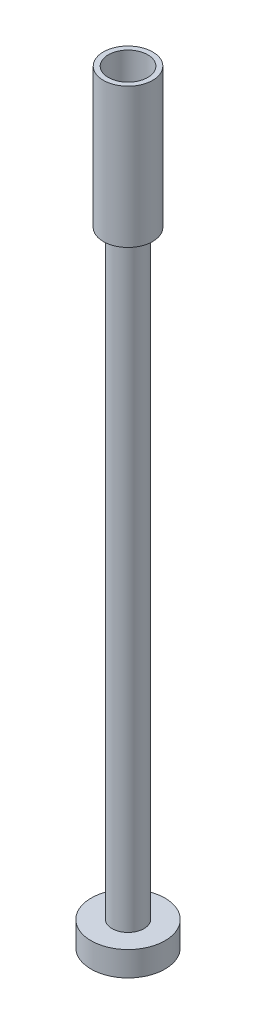
ISO-10303-21;
HEADER;
FILE_DESCRIPTION(('STEP AP214'),'2;1');
FILE_NAME('part.step','',(''),(''),'','','');
FILE_SCHEMA(('AUTOMOTIVE_DESIGN { 1 0 10303 214 1 1 1 1 }'));
ENDSEC;
DATA;
#1=APPLICATION_CONTEXT('core data for automotive mechanical design processes');
#2=APPLICATION_PROTOCOL_DEFINITION('international standard','automotive_design',2000,#1);
#3=PRODUCT_CONTEXT('',#1,'mechanical');
#4=PRODUCT('Part','Part','',(#3));
#5=PRODUCT_RELATED_PRODUCT_CATEGORY('part','',(#4));
#6=PRODUCT_DEFINITION_FORMATION('','',#4);
#7=PRODUCT_DEFINITION_CONTEXT('part definition',#1,'design');
#8=PRODUCT_DEFINITION('design','',#6,#7);
#9=PRODUCT_DEFINITION_SHAPE('','',#8);
#10=(LENGTH_UNIT() NAMED_UNIT(*) SI_UNIT(.MILLI.,.METRE.));
#11=(NAMED_UNIT(*) PLANE_ANGLE_UNIT() SI_UNIT($,.RADIAN.));
#12=(NAMED_UNIT(*) SI_UNIT($,.STERADIAN.) SOLID_ANGLE_UNIT());
#13=UNCERTAINTY_MEASURE_WITH_UNIT(LENGTH_MEASURE(1.E-05),#10,'distance_accuracy_value','');
#14=(GEOMETRIC_REPRESENTATION_CONTEXT(3) GLOBAL_UNCERTAINTY_ASSIGNED_CONTEXT((#13)) GLOBAL_UNIT_ASSIGNED_CONTEXT((#10,
#11,#12)) REPRESENTATION_CONTEXT('',''));
#15=CARTESIAN_POINT('',(0.,0.,0.));
#16=DIRECTION('',(0.,0.,1.));
#17=DIRECTION('',(1.,0.,0.));
#18=AXIS2_PLACEMENT_3D('',#15,#16,#17);
#19=CARTESIAN_POINT('',(-5.56320867014476,38.1,0.43512799364264));
#20=DIRECTION('',(0.,-1.,0.));
#21=DIRECTION('',(0.,0.,-1.));
#22=AXIS2_PLACEMENT_3D('',#19,#20,#21);
#23=CYLINDRICAL_SURFACE('',#22,0.8255);
#24=CARTESIAN_POINT('',(-5.56320867014476,0.,0.43512799364264));
#25=DIRECTION('',(0.,1.,0.));
#26=DIRECTION('',(0.,0.,1.));
#27=AXIS2_PLACEMENT_3D('',#24,#25,#26);
#28=CIRCLE('',#27,0.8255);
#29=CARTESIAN_POINT('',(-5.56320867014476,0.,-0.39037200635736));
#30=VERTEX_POINT('',#29);
#31=EDGE_CURVE('E269',#30,#30,#28,.T.);
#32=CARTESIAN_POINT('',(-5.56320867014476,30.8993926405873,0.43512799364264));
#33=DIRECTION('',(0.,1.,0.));
#34=DIRECTION('',(0.,0.,1.));
#35=AXIS2_PLACEMENT_3D('',#32,#33,#34);
#36=CIRCLE('',#35,0.8255);
#37=CARTESIAN_POINT('',(-5.56320867014476,30.8993926405873,-0.39037200635736));
#38=VERTEX_POINT('',#37);
#39=EDGE_CURVE('E274',#38,#38,#36,.T.);
#40=CARTESIAN_POINT('',(-5.56320867014476,0.,-0.39037200635736));
#41=CARTESIAN_POINT('',(-5.56320867014476,0.321868673339449,-0.39037200635736));
#42=CARTESIAN_POINT('',(-5.56320867014476,0.643737346678899,-0.39037200635736));
#43=CARTESIAN_POINT('',(-5.56320867014476,1.2874746933578,-0.39037200635736));
#44=CARTESIAN_POINT('',(-5.56320867014476,1.60934336669725,-0.39037200635736));
#45=CARTESIAN_POINT('',(-5.56320867014476,2.25308071337615,-0.39037200635736));
#46=CARTESIAN_POINT('',(-5.56320867014476,2.5749493867156,-0.39037200635736));
#47=CARTESIAN_POINT('',(-5.56320867014476,3.21868673339451,-0.39037200635736));
#48=CARTESIAN_POINT('',(-5.56320867014476,3.54055540673396,-0.39037200635736));
#49=CARTESIAN_POINT('',(-5.56320867014476,4.18429275341286,-0.39037200635736));
#50=CARTESIAN_POINT('',(-5.56320867014476,4.50616142675231,-0.39037200635736));
#51=CARTESIAN_POINT('',(-5.56320867014476,5.14989877343121,-0.39037200635736));
#52=CARTESIAN_POINT('',(-5.56320867014476,5.47176744677066,-0.39037200635736));
#53=CARTESIAN_POINT('',(-5.56320867014476,6.11550479344956,-0.39037200635736));
#54=CARTESIAN_POINT('',(-5.56320867014476,6.43737346678901,-0.39037200635736));
#55=CARTESIAN_POINT('',(-5.56320867014476,7.08111081346791,-0.39037200635736));
#56=CARTESIAN_POINT('',(-5.56320867014476,7.40297948680736,-0.39037200635736));
#57=CARTESIAN_POINT('',(-5.56320867014476,8.04671683348626,-0.39037200635736));
#58=CARTESIAN_POINT('',(-5.56320867014476,8.36858550682571,-0.39037200635736));
#59=CARTESIAN_POINT('',(-5.56320867014476,9.01232285350461,-0.39037200635736));
#60=CARTESIAN_POINT('',(-5.56320867014476,9.33419152684406,-0.39037200635736));
#61=CARTESIAN_POINT('',(-5.56320867014476,9.97792887352296,-0.39037200635736));
#62=CARTESIAN_POINT('',(-5.56320867014476,10.2997975468624,-0.39037200635736));
#63=CARTESIAN_POINT('',(-5.56320867014476,10.9435348935413,-0.39037200635736));
#64=CARTESIAN_POINT('',(-5.56320867014476,11.2654035668808,-0.39037200635736));
#65=CARTESIAN_POINT('',(-5.56320867014476,11.9091409135597,-0.39037200635736));
#66=CARTESIAN_POINT('',(-5.56320867014476,12.2310095868991,-0.39037200635736));
#67=CARTESIAN_POINT('',(-5.56320867014476,12.874746933578,-0.39037200635736));
#68=CARTESIAN_POINT('',(-5.56320867014476,13.1966156069175,-0.39037200635736));
#69=CARTESIAN_POINT('',(-5.56320867014476,13.8403529535964,-0.39037200635736));
#70=CARTESIAN_POINT('',(-5.56320867014476,14.1622216269358,-0.39037200635736));
#71=CARTESIAN_POINT('',(-5.56320867014476,14.8059589736147,-0.39037200635736));
#72=CARTESIAN_POINT('',(-5.56320867014476,15.1278276469542,-0.39037200635736));
#73=CARTESIAN_POINT('',(-5.56320867014476,15.7715649936331,-0.39037200635736));
#74=CARTESIAN_POINT('',(-5.56320867014476,16.0934336669725,-0.39037200635736));
#75=CARTESIAN_POINT('',(-5.56320867014476,16.7371710136514,-0.39037200635736));
#76=CARTESIAN_POINT('',(-5.56320867014476,17.0590396869909,-0.39037200635736));
#77=CARTESIAN_POINT('',(-5.56320867014476,17.7027770336698,-0.39037200635736));
#78=CARTESIAN_POINT('',(-5.56320867014476,18.0246457070092,-0.39037200635736));
#79=CARTESIAN_POINT('',(-5.56320867014476,18.6683830536881,-0.39037200635736));
#80=CARTESIAN_POINT('',(-5.56320867014476,18.9902517270276,-0.39037200635736));
#81=CARTESIAN_POINT('',(-5.56320867014476,19.6339890737065,-0.39037200635736));
#82=CARTESIAN_POINT('',(-5.56320867014476,19.9558577470459,-0.39037200635736));
#83=CARTESIAN_POINT('',(-5.56320867014476,20.5995950937248,-0.39037200635736));
#84=CARTESIAN_POINT('',(-5.56320867014476,20.9214637670643,-0.39037200635736));
#85=CARTESIAN_POINT('',(-5.56320867014476,21.5652011137432,-0.39037200635736));
#86=CARTESIAN_POINT('',(-5.56320867014476,21.8870697870826,-0.39037200635736));
#87=CARTESIAN_POINT('',(-5.56320867014476,22.5308071337615,-0.39037200635736));
#88=CARTESIAN_POINT('',(-5.56320867014476,22.852675807101,-0.39037200635736));
#89=CARTESIAN_POINT('',(-5.56320867014476,23.4964131537799,-0.39037200635736));
#90=CARTESIAN_POINT('',(-5.56320867014476,23.8182818271193,-0.39037200635736));
#91=CARTESIAN_POINT('',(-5.56320867014476,24.4620191737982,-0.39037200635736));
#92=CARTESIAN_POINT('',(-5.56320867014476,24.7838878471377,-0.39037200635736));
#93=CARTESIAN_POINT('',(-5.56320867014476,25.4276251938166,-0.39037200635736));
#94=CARTESIAN_POINT('',(-5.56320867014476,25.749493867156,-0.39037200635736));
#95=CARTESIAN_POINT('',(-5.56320867014476,26.3932312138349,-0.39037200635736));
#96=CARTESIAN_POINT('',(-5.56320867014476,26.7150998871744,-0.39037200635736));
#97=CARTESIAN_POINT('',(-5.56320867014476,27.3588372338533,-0.39037200635736));
#98=CARTESIAN_POINT('',(-5.56320867014476,27.6807059071927,-0.39037200635736));
#99=CARTESIAN_POINT('',(-5.56320867014476,28.3244432538716,-0.39037200635736));
#100=CARTESIAN_POINT('',(-5.56320867014476,28.6463119272111,-0.39037200635736));
#101=CARTESIAN_POINT('',(-5.56320867014476,29.29004927389,-0.39037200635736));
#102=CARTESIAN_POINT('',(-5.56320867014476,29.6119179472295,-0.39037200635736));
#103=CARTESIAN_POINT('',(-5.56320867014476,30.2556552939083,-0.39037200635736));
#104=CARTESIAN_POINT('',(-5.56320867014476,30.5775239672478,-0.39037200635736));
#105=CARTESIAN_POINT('',(-5.56320867014476,30.8993926405873,-0.39037200635736));
#106=B_SPLINE_CURVE_WITH_KNOTS('',3,(#40,#41,#42,#43,#44,#45,#46,#47,#48,#49,#50,#51,#52,#53,
#54,#55,#56,#57,#58,#59,#60,#61,#62,#63,#64,#65,#66,#67,#68,#69,#70,#71,#72,#73,#74,#75,#76,#77,
#78,#79,#80,#81,#82,#83,#84,#85,#86,#87,#88,#89,#90,#91,#92,#93,#94,#95,#96,#97,#98,#99,#100,
#101,#102,#103,#104,#105),.UNSPECIFIED.,.F.,.F.,(4,2,2,2,2,2,2,2,2,2,2,2,2,2,2,2,2,2,2,2,2,2,2,
2,2,2,2,2,2,2,2,2,4),(0.,0.965606020018349,1.9312120400367,2.89681806005505,3.86242408007341,
4.82803010009176,5.79363612011011,6.75924214012846,7.72484816014681,8.69045418016516,
9.65606020018351,10.6216662202019,11.5872722402202,12.5528782602386,13.5184842802569,
14.4840903002753,15.4496963202936,16.415302340312,17.3809083603303,18.3465143803487,
19.312120400367,20.2777264203854,21.2433324404037,22.2089384604221,23.1745444804404,
24.1401505004588,25.1057565204771,26.0713625404955,27.0369685605138,28.0025745805322,
28.9681806005505,29.9337866205689,30.8993926405873),.UNSPECIFIED.);
#107=EDGE_CURVE('BSEAM186',#30,#38,#106,.T.);
#108=ORIENTED_EDGE('',*,*,#31,.T.);
#109=ORIENTED_EDGE('',*,*,#39,.F.);
#110=ORIENTED_EDGE('',*,*,#107,.T.);
#111=ORIENTED_EDGE('',*,*,#107,.F.);
#112=EDGE_LOOP('',(#108,#110,#109,#111));
#113=FACE_BOUND('',#112,.T.);
#114=ADVANCED_FACE('F186',(#113),#23,.T.);
#115=CARTESIAN_POINT('',(-5.56320867014476,-1.27,0.43512799364264));
#116=DIRECTION('',(0.,1.,0.));
#117=DIRECTION('',(0.,0.,1.));
#118=AXIS2_PLACEMENT_3D('',#115,#116,#117);
#119=CYLINDRICAL_SURFACE('',#118,1.905);
#120=CARTESIAN_POINT('',(-5.56320867014476,-1.27,0.43512799364264));
#121=DIRECTION('',(0.,-1.,0.));
#122=DIRECTION('',(0.,0.,-1.));
#123=AXIS2_PLACEMENT_3D('',#120,#121,#122);
#124=CIRCLE('',#123,1.905);
#125=CARTESIAN_POINT('',(-5.56320867014476,-1.27,-1.46987200635736));
#126=VERTEX_POINT('',#125);
#127=EDGE_CURVE('E266',#126,#126,#124,.T.);
#128=ORIENTED_EDGE('',*,*,#127,.F.);
#129=EDGE_LOOP('',(#128));
#130=FACE_BOUND('',#129,.T.);
#131=CARTESIAN_POINT('',(-5.56320867014476,0.,0.43512799364264));
#132=DIRECTION('',(0.,-1.,0.));
#133=DIRECTION('',(0.,0.,-1.));
#134=AXIS2_PLACEMENT_3D('',#131,#132,#133);
#135=CIRCLE('',#134,1.905);
#136=CARTESIAN_POINT('',(-5.56320867014476,0.,-1.46987200635736));
#137=VERTEX_POINT('',#136);
#138=EDGE_CURVE('E263',#137,#137,#135,.T.);
#139=ORIENTED_EDGE('',*,*,#138,.T.);
#140=EDGE_LOOP('',(#139));
#141=FACE_BOUND('',#140,.T.);
#142=ADVANCED_FACE('F311',(#130,#141),#119,.T.);
#143=CARTESIAN_POINT('',(-5.56320867014476,-1.27,0.43512799364264));
#144=DIRECTION('',(0.,-1.,0.));
#145=DIRECTION('',(0.,0.,-1.));
#146=AXIS2_PLACEMENT_3D('',#143,#144,#145);
#147=PLANE('',#146);
#148=ORIENTED_EDGE('',*,*,#127,.T.);
#149=EDGE_LOOP('',(#148));
#150=FACE_BOUND('',#149,.T.);
#151=ADVANCED_FACE('F316',(#150),#147,.T.);
#152=CARTESIAN_POINT('',(-5.56320867014476,0.,0.43512799364264));
#153=DIRECTION('',(0.,-1.,0.));
#154=DIRECTION('',(0.,0.,-1.));
#155=AXIS2_PLACEMENT_3D('',#152,#153,#154);
#156=PLANE('',#155);
#157=ORIENTED_EDGE('',*,*,#31,.F.);
#158=EDGE_LOOP('',(#157));
#159=FACE_BOUND('',#158,.T.);
#160=ORIENTED_EDGE('',*,*,#138,.F.);
#161=EDGE_LOOP('',(#160));
#162=FACE_BOUND('',#161,.T.);
#163=ADVANCED_FACE('F289',(#159,#162),#156,.F.);
#164=CARTESIAN_POINT('',(-5.56320867014476,30.8993926405873,0.43512799364264));
#165=DIRECTION('',(0.,1.,0.));
#166=DIRECTION('',(0.,0.,1.));
#167=AXIS2_PLACEMENT_3D('',#164,#165,#166);
#168=CYLINDRICAL_SURFACE('',#167,1.27);
#169=DIRECTION('',(0.,1.,0.));
#170=VECTOR('',#169,1.);
#171=CARTESIAN_POINT('',(-6.75634052754717,30.8993926405873,0.));
#172=LINE('',#171,#170);
#173=CARTESIAN_POINT('',(-6.75634052754717,32.8948050832584,0.));
#174=VERTEX_POINT('',#173);
#175=CARTESIAN_POINT('',(-6.75634052754717,31.8788050832584,0.));
#176=VERTEX_POINT('',#175);
#177=EDGE_CURVE('E12',#174,#176,#172,.F.);
#178=ORIENTED_EDGE('',*,*,#177,.F.);
#179=CARTESIAN_POINT('',(-5.56320867014476,32.8948050832584,0.43512799364264));
#180=DIRECTION('',(0.,1.,0.));
#181=DIRECTION('',(0.,0.,1.));
#182=AXIS2_PLACEMENT_3D('',#179,#180,#181);
#183=CIRCLE('',#182,1.27);
#184=CARTESIAN_POINT('',(-6.83284512633673,32.8948050832584,0.40474265));
#185=VERTEX_POINT('',#184);
#186=EDGE_CURVE('E193',#185,#174,#183,.F.);
#187=ORIENTED_EDGE('',*,*,#186,.F.);
#188=DIRECTION('',(0.,1.,0.));
#189=VECTOR('',#188,1.);
#190=CARTESIAN_POINT('',(-6.83284512633673,30.8993926405873,0.40474265));
#191=LINE('',#190,#189);
#192=CARTESIAN_POINT('',(-6.83284512633673,31.8788050832584,0.40474265));
#193=VERTEX_POINT('',#192);
#194=EDGE_CURVE('E279',#193,#185,#191,.T.);
#195=ORIENTED_EDGE('',*,*,#194,.F.);
#196=CARTESIAN_POINT('',(-5.56320867014476,31.8788050832584,0.43512799364264));
#197=DIRECTION('',(0.,-1.,0.));
#198=DIRECTION('',(0.,0.,-1.));
#199=AXIS2_PLACEMENT_3D('',#196,#197,#198);
#200=CIRCLE('',#199,1.27);
#201=EDGE_CURVE('E277',#176,#193,#200,.F.);
#202=ORIENTED_EDGE('',*,*,#201,.F.);
#203=EDGE_LOOP('',(#178,#187,#195,#202));
#204=FACE_BOUND('',#203,.T.);
#205=CARTESIAN_POINT('',(-5.56320867014476,30.8993926405873,0.43512799364264));
#206=DIRECTION('',(0.,1.,0.));
#207=DIRECTION('',(0.,0.,1.));
#208=AXIS2_PLACEMENT_3D('',#205,#206,#207);
#209=CIRCLE('',#208,1.27);
#210=CARTESIAN_POINT('',(-5.56320867014476,30.8993926405873,1.70512799364264));
#211=VERTEX_POINT('',#210);
#212=EDGE_CURVE('E260',#211,#211,#209,.T.);
#213=ORIENTED_EDGE('',*,*,#212,.T.);
#214=EDGE_LOOP('',(#213));
#215=FACE_BOUND('',#214,.T.);
#216=CARTESIAN_POINT('',(-5.56320867014476,38.1,0.43512799364264));
#217=DIRECTION('',(0.,1.,0.));
#218=DIRECTION('',(0.,0.,1.));
#219=AXIS2_PLACEMENT_3D('',#216,#217,#218);
#220=CIRCLE('',#219,1.27);
#221=CARTESIAN_POINT('',(-5.56320867014476,38.1,1.70512799364264));
#222=VERTEX_POINT('',#221);
#223=EDGE_CURVE('E257',#222,#222,#220,.T.);
#224=ORIENTED_EDGE('',*,*,#223,.F.);
#225=EDGE_LOOP('',(#224));
#226=FACE_BOUND('',#225,.T.);
#227=ADVANCED_FACE('F285',(#204,#215,#226),#168,.T.);
#228=CARTESIAN_POINT('',(-5.56320867014476,30.8993926405873,0.43512799364264));
#229=DIRECTION('',(0.,1.,0.));
#230=DIRECTION('',(0.,0.,1.));
#231=AXIS2_PLACEMENT_3D('',#228,#229,#230);
#232=PLANE('',#231);
#233=ORIENTED_EDGE('',*,*,#39,.T.);
#234=EDGE_LOOP('',(#233));
#235=FACE_BOUND('',#234,.T.);
#236=ORIENTED_EDGE('',*,*,#212,.F.);
#237=EDGE_LOOP('',(#236));
#238=FACE_BOUND('',#237,.T.);
#239=ADVANCED_FACE('F288',(#235,#238),#232,.F.);
#240=CARTESIAN_POINT('',(-5.56320867014476,38.1,0.43512799364264));
#241=DIRECTION('',(0.,1.,0.));
#242=DIRECTION('',(0.,0.,1.));
#243=AXIS2_PLACEMENT_3D('',#240,#241,#242);
#244=PLANE('',#243);
#245=CARTESIAN_POINT('',(-5.56320867014476,38.1,0.43512799364264));
#246=DIRECTION('',(0.,1.,0.));
#247=DIRECTION('',(0.,0.,1.));
#248=AXIS2_PLACEMENT_3D('',#245,#246,#247);
#249=CIRCLE('',#248,1.016);
#250=CARTESIAN_POINT('',(-5.56320867014476,38.1,1.45112799364264));
#251=VERTEX_POINT('',#250);
#252=EDGE_CURVE('E250',#251,#251,#249,.T.);
#253=ORIENTED_EDGE('',*,*,#252,.F.);
#254=EDGE_LOOP('',(#253));
#255=FACE_BOUND('',#254,.T.);
#256=ORIENTED_EDGE('',*,*,#223,.T.);
#257=EDGE_LOOP('',(#256));
#258=FACE_BOUND('',#257,.T.);
#259=ADVANCED_FACE('F295',(#255,#258),#244,.T.);
#260=CARTESIAN_POINT('',(-5.56320867014476,36.068,0.43512799364264));
#261=DIRECTION('',(0.,1.,0.));
#262=DIRECTION('',(0.,0.,1.));
#263=AXIS2_PLACEMENT_3D('',#260,#261,#262);
#264=CYLINDRICAL_SURFACE('',#263,1.016);
#265=CARTESIAN_POINT('',(-5.56320867014476,36.068,0.43512799364264));
#266=DIRECTION('',(0.,1.,0.));
#267=DIRECTION('',(0.,0.,1.));
#268=AXIS2_PLACEMENT_3D('',#265,#266,#267);
#269=CIRCLE('',#268,1.016);
#270=CARTESIAN_POINT('',(-5.56320867014476,36.068,1.45112799364264));
#271=VERTEX_POINT('',#270);
#272=EDGE_CURVE('E254',#271,#271,#269,.T.);
#273=ORIENTED_EDGE('',*,*,#272,.F.);
#274=EDGE_LOOP('',(#273));
#275=FACE_BOUND('',#274,.T.);
#276=ORIENTED_EDGE('',*,*,#252,.T.);
#277=EDGE_LOOP('',(#276));
#278=FACE_BOUND('',#277,.T.);
#279=ADVANCED_FACE('F297',(#275,#278),#264,.F.);
#280=CARTESIAN_POINT('',(-5.56320867014476,36.068,0.43512799364264));
#281=DIRECTION('',(0.,1.,0.));
#282=DIRECTION('',(0.,0.,1.));
#283=AXIS2_PLACEMENT_3D('',#280,#281,#282);
#284=PLANE('',#283);
#285=ORIENTED_EDGE('',*,*,#272,.T.);
#286=EDGE_LOOP('',(#285));
#287=FACE_BOUND('',#286,.T.);
#288=ADVANCED_FACE('F303',(#287),#284,.T.);
#289=CARTESIAN_POINT('',(-6.07120867014476,31.8788050832584,0.));
#290=DIRECTION('',(0.,0.,-1.));
#291=DIRECTION('',(-1.,0.,0.));
#292=AXIS2_PLACEMENT_3D('',#289,#290,#291);
#293=PLANE('',#292);
#294=ORIENTED_EDGE('',*,*,#177,.T.);
#295=DIRECTION('',(-1.,0.,0.));
#296=VECTOR('',#295,1.);
#297=CARTESIAN_POINT('',(-6.07120867014476,31.8788050832584,0.));
#298=LINE('',#297,#296);
#299=CARTESIAN_POINT('',(-6.07120867014476,31.8788050832584,0.));
#300=VERTEX_POINT('',#299);
#301=EDGE_CURVE('E200',#300,#176,#298,.T.);
#302=ORIENTED_EDGE('',*,*,#301,.F.);
#303=DIRECTION('',(0.,-1.,0.));
#304=VECTOR('',#303,1.);
#305=CARTESIAN_POINT('',(-6.07120867014476,31.8788050832584,0.));
#306=LINE('',#305,#304);
#307=CARTESIAN_POINT('',(-6.07120867014476,32.8948050832584,0.));
#308=VERTEX_POINT('',#307);
#309=EDGE_CURVE('E226',#308,#300,#306,.T.);
#310=ORIENTED_EDGE('',*,*,#309,.F.);
#311=DIRECTION('',(-1.,0.,0.));
#312=VECTOR('',#311,1.);
#313=CARTESIAN_POINT('',(-6.07120867014476,32.8948050832584,0.));
#314=LINE('',#313,#312);
#315=EDGE_CURVE('E248',#308,#174,#314,.T.);
#316=ORIENTED_EDGE('',*,*,#315,.T.);
#317=EDGE_LOOP('',(#294,#302,#310,#316));
#318=FACE_BOUND('',#317,.T.);
#319=ADVANCED_FACE('F224',(#318),#293,.F.);
#320=CARTESIAN_POINT('',(-6.07120867014476,32.8948050832584,0.));
#321=DIRECTION('',(0.,1.,0.));
#322=DIRECTION('',(0.,0.,1.));
#323=AXIS2_PLACEMENT_3D('',#320,#321,#322);
#324=PLANE('',#323);
#325=ORIENTED_EDGE('',*,*,#186,.T.);
#326=ORIENTED_EDGE('',*,*,#315,.F.);
#327=DIRECTION('',(0.,0.,-1.));
#328=VECTOR('',#327,1.);
#329=CARTESIAN_POINT('',(-6.07120867014476,32.8948050832584,0.));
#330=LINE('',#329,#328);
#331=CARTESIAN_POINT('',(-6.07120867014476,32.8948050832584,0.40474265));
#332=VERTEX_POINT('',#331);
#333=EDGE_CURVE('E231',#332,#308,#330,.T.);
#334=ORIENTED_EDGE('',*,*,#333,.F.);
#335=DIRECTION('',(-1.,0.,0.));
#336=VECTOR('',#335,1.);
#337=CARTESIAN_POINT('',(-6.07120867014476,32.8948050832584,0.40474265));
#338=LINE('',#337,#336);
#339=EDGE_CURVE('E251',#332,#185,#338,.T.);
#340=ORIENTED_EDGE('',*,*,#339,.T.);
#341=EDGE_LOOP('',(#325,#326,#334,#340));
#342=FACE_BOUND('',#341,.T.);
#343=ADVANCED_FACE('F284',(#342),#324,.F.);
#344=CARTESIAN_POINT('',(-6.07120867014476,31.8788050832584,0.40474265));
#345=DIRECTION('',(0.,0.,1.));
#346=DIRECTION('',(1.,0.,0.));
#347=AXIS2_PLACEMENT_3D('',#344,#345,#346);
#348=PLANE('',#347);
#349=ORIENTED_EDGE('',*,*,#194,.T.);
#350=ORIENTED_EDGE('',*,*,#339,.F.);
#351=DIRECTION('',(0.,1.,0.));
#352=VECTOR('',#351,1.);
#353=CARTESIAN_POINT('',(-6.07120867014476,31.8788050832584,0.40474265));
#354=LINE('',#353,#352);
#355=CARTESIAN_POINT('',(-6.07120867014476,31.8788050832584,0.40474265));
#356=VERTEX_POINT('',#355);
#357=EDGE_CURVE('E240',#356,#332,#354,.T.);
#358=ORIENTED_EDGE('',*,*,#357,.F.);
#359=DIRECTION('',(-1.,0.,0.));
#360=VECTOR('',#359,1.);
#361=CARTESIAN_POINT('',(-6.07120867014476,31.8788050832584,0.40474265));
#362=LINE('',#361,#360);
#363=EDGE_CURVE('E230',#356,#193,#362,.T.);
#364=ORIENTED_EDGE('',*,*,#363,.T.);
#365=EDGE_LOOP('',(#349,#350,#358,#364));
#366=FACE_BOUND('',#365,.T.);
#367=ADVANCED_FACE('F282',(#366),#348,.F.);
#368=CARTESIAN_POINT('',(-6.07120867014476,31.8788050832584,0.));
#369=DIRECTION('',(0.,-1.,0.));
#370=DIRECTION('',(0.,0.,-1.));
#371=AXIS2_PLACEMENT_3D('',#368,#369,#370);
#372=PLANE('',#371);
#373=ORIENTED_EDGE('',*,*,#201,.T.);
#374=ORIENTED_EDGE('',*,*,#363,.F.);
#375=DIRECTION('',(0.,0.,1.));
#376=VECTOR('',#375,1.);
#377=CARTESIAN_POINT('',(-6.07120867014476,31.8788050832584,0.));
#378=LINE('',#377,#376);
#379=EDGE_CURVE('E234',#300,#356,#378,.T.);
#380=ORIENTED_EDGE('',*,*,#379,.F.);
#381=ORIENTED_EDGE('',*,*,#301,.T.);
#382=EDGE_LOOP('',(#373,#374,#380,#381));
#383=FACE_BOUND('',#382,.T.);
#384=ADVANCED_FACE('F235',(#383),#372,.F.);
#385=CARTESIAN_POINT('',(-6.07120867014476,0.,0.));
#386=DIRECTION('',(1.,0.,0.));
#387=DIRECTION('',(0.,0.,-1.));
#388=AXIS2_PLACEMENT_3D('',#385,#386,#387);
#389=PLANE('',#388);
#390=ORIENTED_EDGE('',*,*,#309,.T.);
#391=ORIENTED_EDGE('',*,*,#379,.T.);
#392=ORIENTED_EDGE('',*,*,#357,.T.);
#393=ORIENTED_EDGE('',*,*,#333,.T.);
#394=EDGE_LOOP('',(#390,#391,#392,#393));
#395=FACE_BOUND('',#394,.T.);
#396=ADVANCED_FACE('F242',(#395),#389,.F.);
#397=CLOSED_SHELL('',(#114,#142,#151,#163,#227,#239,#259,#279,#288,#319,#343,#367,#384,#396));
#398=MANIFOLD_SOLID_BREP('B2',#397);
#399=ADVANCED_BREP_SHAPE_REPRESENTATION('',(#18,#398),#14);
#400=SHAPE_DEFINITION_REPRESENTATION(#9,#399);
ENDSEC;
END-ISO-10303-21;
